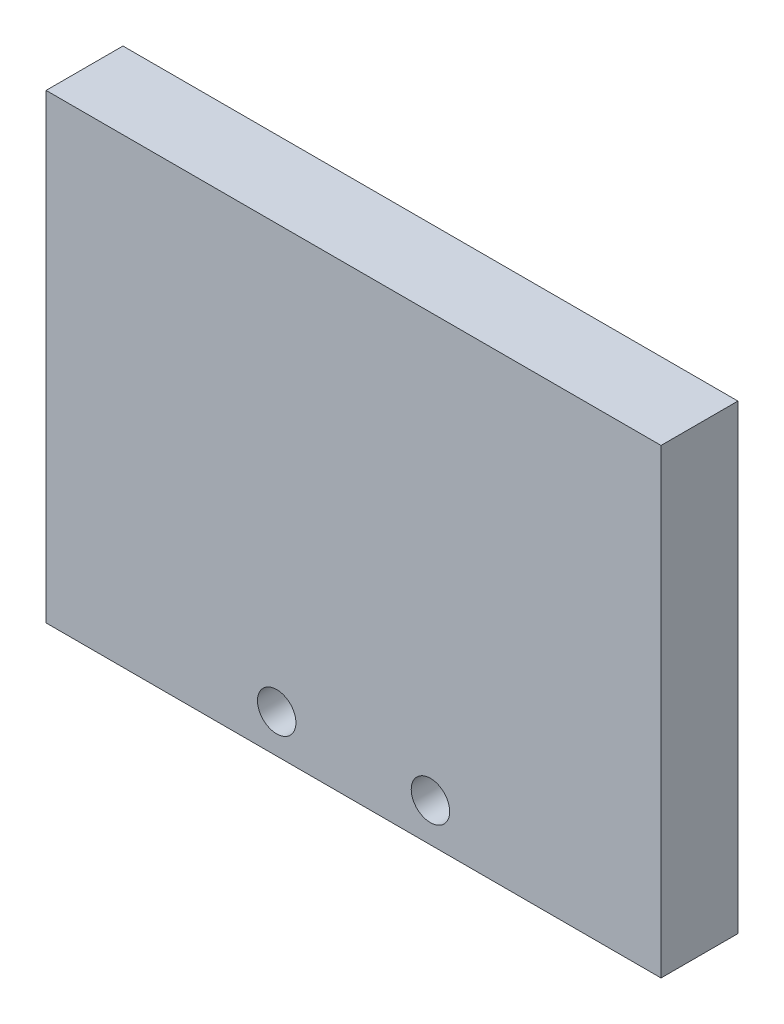
ISO-10303-21;
HEADER;
FILE_DESCRIPTION(('STEP AP214'),'2;1');
FILE_NAME('part.step','',(''),(''),'','','');
FILE_SCHEMA(('AUTOMOTIVE_DESIGN { 1 0 10303 214 1 1 1 1 }'));
ENDSEC;
DATA;
#1=APPLICATION_CONTEXT('core data for automotive mechanical design processes');
#2=APPLICATION_PROTOCOL_DEFINITION('international standard','automotive_design',2000,#1);
#3=PRODUCT_CONTEXT('',#1,'mechanical');
#4=PRODUCT('Part','Part','',(#3));
#5=PRODUCT_RELATED_PRODUCT_CATEGORY('part','',(#4));
#6=PRODUCT_DEFINITION_FORMATION('','',#4);
#7=PRODUCT_DEFINITION_CONTEXT('part definition',#1,'design');
#8=PRODUCT_DEFINITION('design','',#6,#7);
#9=PRODUCT_DEFINITION_SHAPE('','',#8);
#10=(LENGTH_UNIT() NAMED_UNIT(*) SI_UNIT(.MILLI.,.METRE.));
#11=(NAMED_UNIT(*) PLANE_ANGLE_UNIT() SI_UNIT($,.RADIAN.));
#12=(NAMED_UNIT(*) SI_UNIT($,.STERADIAN.) SOLID_ANGLE_UNIT());
#13=UNCERTAINTY_MEASURE_WITH_UNIT(LENGTH_MEASURE(1.E-05),#10,'distance_accuracy_value','');
#14=(GEOMETRIC_REPRESENTATION_CONTEXT(3) GLOBAL_UNCERTAINTY_ASSIGNED_CONTEXT((#13)) GLOBAL_UNIT_ASSIGNED_CONTEXT((#10,
#11,#12)) REPRESENTATION_CONTEXT('',''));
#15=CARTESIAN_POINT('',(0.,0.,0.));
#16=DIRECTION('',(0.,0.,1.));
#17=DIRECTION('',(1.,0.,0.));
#18=AXIS2_PLACEMENT_3D('',#15,#16,#17);
#19=CARTESIAN_POINT('',(-57.5851064892845,19.8138883737329,10.));
#20=DIRECTION('',(1.,0.,0.));
#21=DIRECTION('',(0.,1.,0.));
#22=AXIS2_PLACEMENT_3D('',#19,#20,#21);
#23=PLANE('',#22);
#24=DIRECTION('',(0.,-1.,0.));
#25=VECTOR('',#24,1.);
#26=CARTESIAN_POINT('',(-57.5851064892845,19.8138883737329,0.));
#27=LINE('',#26,#25);
#28=CARTESIAN_POINT('',(-57.5851064892845,19.8138883737329,0.));
#29=VERTEX_POINT('',#28);
#30=CARTESIAN_POINT('',(-57.5851064892845,-40.1861116262671,0.));
#31=VERTEX_POINT('',#30);
#32=EDGE_CURVE('E99',#29,#31,#27,.T.);
#33=ORIENTED_EDGE('',*,*,#32,.T.);
#34=DIRECTION('',(0.,0.,-1.));
#35=VECTOR('',#34,1.);
#36=CARTESIAN_POINT('',(-57.5851064892845,-40.1861116262671,10.));
#37=LINE('',#36,#35);
#38=CARTESIAN_POINT('',(-57.5851064892845,-40.1861116262671,10.));
#39=VERTEX_POINT('',#38);
#40=EDGE_CURVE('E11',#39,#31,#37,.T.);
#41=ORIENTED_EDGE('',*,*,#40,.F.);
#42=DIRECTION('',(0.,-1.,0.));
#43=VECTOR('',#42,1.);
#44=CARTESIAN_POINT('',(-57.5851064892845,19.8138883737329,10.));
#45=LINE('',#44,#43);
#46=CARTESIAN_POINT('',(-57.5851064892845,19.8138883737329,10.));
#47=VERTEX_POINT('',#46);
#48=EDGE_CURVE('E87',#47,#39,#45,.T.);
#49=ORIENTED_EDGE('',*,*,#48,.F.);
#50=DIRECTION('',(0.,0.,-1.));
#51=VECTOR('',#50,1.);
#52=CARTESIAN_POINT('',(-57.5851064892845,19.8138883737329,10.));
#53=LINE('',#52,#51);
#54=EDGE_CURVE('E95',#47,#29,#53,.T.);
#55=ORIENTED_EDGE('',*,*,#54,.T.);
#56=EDGE_LOOP('',(#33,#41,#49,#55));
#57=FACE_BOUND('',#56,.T.);
#58=ADVANCED_FACE('F36',(#57),#23,.F.);
#59=CARTESIAN_POINT('',(-57.5851064892845,-40.1861116262671,10.));
#60=DIRECTION('',(0.,1.,0.));
#61=DIRECTION('',(0.,0.,1.));
#62=AXIS2_PLACEMENT_3D('',#59,#60,#61);
#63=PLANE('',#62);
#64=DIRECTION('',(1.,0.,0.));
#65=VECTOR('',#64,1.);
#66=CARTESIAN_POINT('',(-57.5851064892845,-40.1861116262671,0.));
#67=LINE('',#66,#65);
#68=CARTESIAN_POINT('',(22.4148935107155,-40.1861116262671,0.));
#69=VERTEX_POINT('',#68);
#70=EDGE_CURVE('E91',#31,#69,#67,.T.);
#71=ORIENTED_EDGE('',*,*,#70,.T.);
#72=DIRECTION('',(0.,0.,-1.));
#73=VECTOR('',#72,1.);
#74=CARTESIAN_POINT('',(22.4148935107155,-40.1861116262671,10.));
#75=LINE('',#74,#73);
#76=CARTESIAN_POINT('',(22.4148935107155,-40.1861116262671,10.));
#77=VERTEX_POINT('',#76);
#78=EDGE_CURVE('E44',#77,#69,#75,.T.);
#79=ORIENTED_EDGE('',*,*,#78,.F.);
#80=DIRECTION('',(1.,0.,0.));
#81=VECTOR('',#80,1.);
#82=CARTESIAN_POINT('',(-57.5851064892845,-40.1861116262671,10.));
#83=LINE('',#82,#81);
#84=EDGE_CURVE('E82',#39,#77,#83,.T.);
#85=ORIENTED_EDGE('',*,*,#84,.F.);
#86=ORIENTED_EDGE('',*,*,#40,.T.);
#87=EDGE_LOOP('',(#71,#79,#85,#86));
#88=FACE_BOUND('',#87,.T.);
#89=ADVANCED_FACE('F90',(#88),#63,.F.);
#90=CARTESIAN_POINT('',(22.4148935107155,19.8138883737329,10.));
#91=DIRECTION('',(-1.,0.,0.));
#92=DIRECTION('',(0.,-1.,0.));
#93=AXIS2_PLACEMENT_3D('',#90,#91,#92);
#94=PLANE('',#93);
#95=DIRECTION('',(0.,1.,0.));
#96=VECTOR('',#95,1.);
#97=CARTESIAN_POINT('',(22.4148935107155,19.8138883737329,0.));
#98=LINE('',#97,#96);
#99=CARTESIAN_POINT('',(22.4148935107155,19.8138883737329,0.));
#100=VERTEX_POINT('',#99);
#101=EDGE_CURVE('E69',#69,#100,#98,.T.);
#102=ORIENTED_EDGE('',*,*,#101,.T.);
#103=DIRECTION('',(0.,0.,-1.));
#104=VECTOR('',#103,1.);
#105=CARTESIAN_POINT('',(22.4148935107155,19.8138883737329,10.));
#106=LINE('',#105,#104);
#107=CARTESIAN_POINT('',(22.4148935107155,19.8138883737329,10.));
#108=VERTEX_POINT('',#107);
#109=EDGE_CURVE('E92',#108,#100,#106,.T.);
#110=ORIENTED_EDGE('',*,*,#109,.F.);
#111=DIRECTION('',(0.,1.,0.));
#112=VECTOR('',#111,1.);
#113=CARTESIAN_POINT('',(22.4148935107155,19.8138883737329,10.));
#114=LINE('',#113,#112);
#115=EDGE_CURVE('E85',#77,#108,#114,.T.);
#116=ORIENTED_EDGE('',*,*,#115,.F.);
#117=ORIENTED_EDGE('',*,*,#78,.T.);
#118=EDGE_LOOP('',(#102,#110,#116,#117));
#119=FACE_BOUND('',#118,.T.);
#120=ADVANCED_FACE('F93',(#119),#94,.F.);
#121=CARTESIAN_POINT('',(-57.5851064892845,19.8138883737329,10.));
#122=DIRECTION('',(0.,-1.,0.));
#123=DIRECTION('',(0.,0.,-1.));
#124=AXIS2_PLACEMENT_3D('',#121,#122,#123);
#125=PLANE('',#124);
#126=DIRECTION('',(-1.,0.,0.));
#127=VECTOR('',#126,1.);
#128=CARTESIAN_POINT('',(-57.5851064892845,19.8138883737329,0.));
#129=LINE('',#128,#127);
#130=EDGE_CURVE('E75',#100,#29,#129,.T.);
#131=ORIENTED_EDGE('',*,*,#130,.T.);
#132=ORIENTED_EDGE('',*,*,#54,.F.);
#133=DIRECTION('',(-1.,0.,0.));
#134=VECTOR('',#133,1.);
#135=CARTESIAN_POINT('',(-57.5851064892845,19.8138883737329,10.));
#136=LINE('',#135,#134);
#137=EDGE_CURVE('E52',#108,#47,#136,.T.);
#138=ORIENTED_EDGE('',*,*,#137,.F.);
#139=ORIENTED_EDGE('',*,*,#109,.T.);
#140=EDGE_LOOP('',(#131,#132,#138,#139));
#141=FACE_BOUND('',#140,.T.);
#142=ADVANCED_FACE('F107',(#141),#125,.F.);
#143=CARTESIAN_POINT('',(0.,0.,10.));
#144=DIRECTION('',(0.,0.,1.));
#145=DIRECTION('',(1.,0.,0.));
#146=AXIS2_PLACEMENT_3D('',#143,#144,#145);
#147=PLANE('',#146);
#148=CARTESIAN_POINT('',(-27.5851064892845,-35.1861116262671,10.));
#149=DIRECTION('',(0.,0.,1.));
#150=DIRECTION('',(1.,0.,0.));
#151=AXIS2_PLACEMENT_3D('',#148,#149,#150);
#152=CIRCLE('',#151,2.5);
#153=CARTESIAN_POINT('',(-25.0851064892845,-35.1861116262671,10.));
#154=VERTEX_POINT('',#153);
#155=EDGE_CURVE('E119',#154,#154,#152,.T.);
#156=ORIENTED_EDGE('',*,*,#155,.F.);
#157=EDGE_LOOP('',(#156));
#158=FACE_BOUND('',#157,.T.);
#159=CARTESIAN_POINT('',(-7.58510648928448,-35.1861116262671,10.));
#160=DIRECTION('',(0.,0.,1.));
#161=DIRECTION('',(-1.,0.,0.));
#162=AXIS2_PLACEMENT_3D('',#159,#160,#161);
#163=CIRCLE('',#162,2.5);
#164=CARTESIAN_POINT('',(-10.0851064892845,-35.1861116262671,10.));
#165=VERTEX_POINT('',#164);
#166=EDGE_CURVE('E113',#165,#165,#163,.T.);
#167=ORIENTED_EDGE('',*,*,#166,.F.);
#168=EDGE_LOOP('',(#167));
#169=FACE_BOUND('',#168,.T.);
#170=ORIENTED_EDGE('',*,*,#48,.T.);
#171=ORIENTED_EDGE('',*,*,#84,.T.);
#172=ORIENTED_EDGE('',*,*,#115,.T.);
#173=ORIENTED_EDGE('',*,*,#137,.T.);
#174=EDGE_LOOP('',(#170,#171,#172,#173));
#175=FACE_BOUND('',#174,.T.);
#176=ADVANCED_FACE('F83',(#158,#169,#175),#147,.T.);
#177=CARTESIAN_POINT('',(0.,0.,0.));
#178=DIRECTION('',(0.,0.,1.));
#179=DIRECTION('',(1.,0.,0.));
#180=AXIS2_PLACEMENT_3D('',#177,#178,#179);
#181=PLANE('',#180);
#182=CARTESIAN_POINT('',(-27.5851064892845,-35.1861116262671,0.));
#183=DIRECTION('',(0.,0.,1.));
#184=DIRECTION('',(1.,0.,0.));
#185=AXIS2_PLACEMENT_3D('',#182,#183,#184);
#186=CIRCLE('',#185,2.5);
#187=CARTESIAN_POINT('',(-25.0851064892845,-35.1861116262671,0.));
#188=VERTEX_POINT('',#187);
#189=EDGE_CURVE('E102',#188,#188,#186,.T.);
#190=ORIENTED_EDGE('',*,*,#189,.T.);
#191=EDGE_LOOP('',(#190));
#192=FACE_BOUND('',#191,.T.);
#193=CARTESIAN_POINT('',(-7.58510648928448,-35.1861116262671,0.));
#194=DIRECTION('',(0.,0.,1.));
#195=DIRECTION('',(-1.,0.,0.));
#196=AXIS2_PLACEMENT_3D('',#193,#194,#195);
#197=CIRCLE('',#196,2.5);
#198=CARTESIAN_POINT('',(-10.0851064892845,-35.1861116262671,0.));
#199=VERTEX_POINT('',#198);
#200=EDGE_CURVE('E116',#199,#199,#197,.T.);
#201=ORIENTED_EDGE('',*,*,#200,.T.);
#202=EDGE_LOOP('',(#201));
#203=FACE_BOUND('',#202,.T.);
#204=ORIENTED_EDGE('',*,*,#32,.F.);
#205=ORIENTED_EDGE('',*,*,#130,.F.);
#206=ORIENTED_EDGE('',*,*,#101,.F.);
#207=ORIENTED_EDGE('',*,*,#70,.F.);
#208=EDGE_LOOP('',(#204,#205,#206,#207));
#209=FACE_BOUND('',#208,.T.);
#210=ADVANCED_FACE('F110',(#192,#203,#209),#181,.F.);
#211=CARTESIAN_POINT('',(-7.58510648928448,-35.1861116262671,0.));
#212=DIRECTION('',(0.,0.,1.));
#213=DIRECTION('',(1.,0.,0.));
#214=AXIS2_PLACEMENT_3D('',#211,#212,#213);
#215=CYLINDRICAL_SURFACE('',#214,2.5);
#216=ORIENTED_EDGE('',*,*,#200,.F.);
#217=EDGE_LOOP('',(#216));
#218=FACE_BOUND('',#217,.T.);
#219=ORIENTED_EDGE('',*,*,#166,.T.);
#220=EDGE_LOOP('',(#219));
#221=FACE_BOUND('',#220,.T.);
#222=ADVANCED_FACE('F130',(#218,#221),#215,.F.);
#223=CARTESIAN_POINT('',(-27.5851064892845,-35.1861116262671,0.));
#224=DIRECTION('',(0.,0.,1.));
#225=DIRECTION('',(1.,0.,0.));
#226=AXIS2_PLACEMENT_3D('',#223,#224,#225);
#227=CYLINDRICAL_SURFACE('',#226,2.5);
#228=ORIENTED_EDGE('',*,*,#189,.F.);
#229=EDGE_LOOP('',(#228));
#230=FACE_BOUND('',#229,.T.);
#231=ORIENTED_EDGE('',*,*,#155,.T.);
#232=EDGE_LOOP('',(#231));
#233=FACE_BOUND('',#232,.T.);
#234=ADVANCED_FACE('F127',(#230,#233),#227,.F.);
#235=CLOSED_SHELL('',(#58,#89,#120,#142,#176,#210,#222,#234));
#236=MANIFOLD_SOLID_BREP('B2',#235);
#237=ADVANCED_BREP_SHAPE_REPRESENTATION('',(#18,#236),#14);
#238=SHAPE_DEFINITION_REPRESENTATION(#9,#237);
ENDSEC;
END-ISO-10303-21;
